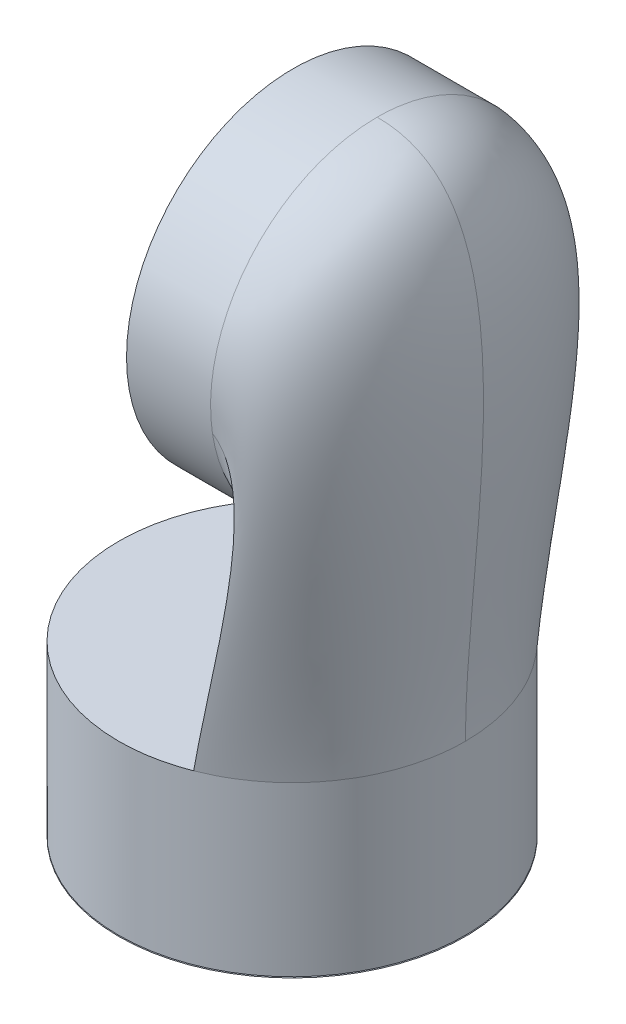
ISO-10303-21;
HEADER;
FILE_DESCRIPTION(('STEP AP214'),'2;1');
FILE_NAME('part.step','',(''),(''),'','','');
FILE_SCHEMA(('AUTOMOTIVE_DESIGN { 1 0 10303 214 1 1 1 1 }'));
ENDSEC;
DATA;
#1=APPLICATION_CONTEXT('core data for automotive mechanical design processes');
#2=APPLICATION_PROTOCOL_DEFINITION('international standard','automotive_design',2000,#1);
#3=PRODUCT_CONTEXT('',#1,'mechanical');
#4=PRODUCT('Part','Part','',(#3));
#5=PRODUCT_RELATED_PRODUCT_CATEGORY('part','',(#4));
#6=PRODUCT_DEFINITION_FORMATION('','',#4);
#7=PRODUCT_DEFINITION_CONTEXT('part definition',#1,'design');
#8=PRODUCT_DEFINITION('design','',#6,#7);
#9=PRODUCT_DEFINITION_SHAPE('','',#8);
#10=(LENGTH_UNIT() NAMED_UNIT(*) SI_UNIT(.MILLI.,.METRE.));
#11=(NAMED_UNIT(*) PLANE_ANGLE_UNIT() SI_UNIT($,.RADIAN.));
#12=(NAMED_UNIT(*) SI_UNIT($,.STERADIAN.) SOLID_ANGLE_UNIT());
#13=UNCERTAINTY_MEASURE_WITH_UNIT(LENGTH_MEASURE(1.E-05),#10,'distance_accuracy_value','');
#14=(GEOMETRIC_REPRESENTATION_CONTEXT(3) GLOBAL_UNCERTAINTY_ASSIGNED_CONTEXT((#13)) GLOBAL_UNIT_ASSIGNED_CONTEXT((#10,
#11,#12)) REPRESENTATION_CONTEXT('',''));
#15=CARTESIAN_POINT('',(0.,0.,0.));
#16=DIRECTION('',(0.,0.,1.));
#17=DIRECTION('',(1.,0.,0.));
#18=AXIS2_PLACEMENT_3D('',#15,#16,#17);
#19=CARTESIAN_POINT('',(0.25,118.750494926719,0.));
#20=DIRECTION('',(1.,0.,0.));
#21=DIRECTION('',(0.,0.,-1.));
#22=AXIS2_PLACEMENT_3D('',#19,#20,#21);
#23=PLANE('',#22);
#24=CARTESIAN_POINT('',(0.25,118.750494926719,0.));
#25=DIRECTION('',(1.,0.,0.));
#26=DIRECTION('',(0.,0.,-1.));
#27=AXIS2_PLACEMENT_3D('',#24,#25,#26);
#28=CIRCLE('',#27,39.6542142174496);
#29=CARTESIAN_POINT('',(0.25,118.750494926719,-39.6542142174496));
#30=VERTEX_POINT('',#29);
#31=EDGE_CURVE('E103',#30,#30,#28,.T.);
#32=ORIENTED_EDGE('',*,*,#31,.F.);
#33=EDGE_LOOP('',(#32));
#34=FACE_BOUND('',#33,.T.);
#35=ADVANCED_FACE('F45',(#34),#23,.F.);
#36=CARTESIAN_POINT('',(0.25,118.750494926719,0.));
#37=DIRECTION('',(1.,0.,0.));
#38=DIRECTION('',(0.,0.,-1.));
#39=AXIS2_PLACEMENT_3D('',#36,#37,#38);
#40=CYLINDRICAL_SURFACE('',#39,39.6542142174496);
#41=CARTESIAN_POINT('',(20.25,112.826886917139,-39.2092791740962));
#42=CARTESIAN_POINT('',(20.25,113.538679207074,-39.3168177632087));
#43=CARTESIAN_POINT('',(20.25,114.253402907254,-39.4049056334469));
#44=CARTESIAN_POINT('',(20.25,115.685413881789,-39.5419672587397));
#45=CARTESIAN_POINT('',(20.25,116.402695064723,-39.5910046455691));
#46=CARTESIAN_POINT('',(20.25,117.8377528083,-39.6500587961813));
#47=CARTESIAN_POINT('',(20.25,118.555526899412,-39.6601356150666));
#48=CARTESIAN_POINT('',(20.25,119.989508155326,-39.6413657401065));
#49=CARTESIAN_POINT('',(20.25,120.705716068375,-39.6125765323938));
#50=CARTESIAN_POINT('',(20.25,122.134504878901,-39.5161681335435));
#51=CARTESIAN_POINT('',(20.25,122.847089453413,-39.4486034323858));
#52=CARTESIAN_POINT('',(20.25,124.266643335228,-39.2751470612482));
#53=CARTESIAN_POINT('',(20.25,124.973618695871,-39.1693048991965));
#54=CARTESIAN_POINT('',(20.25,126.379984634424,-38.9197953732112));
#55=CARTESIAN_POINT('',(20.25,127.079383318844,-38.7761736995566));
#56=CARTESIAN_POINT('',(20.25,128.468626453505,-38.4516045506778));
#57=CARTESIAN_POINT('',(20.25,129.158480894523,-38.2706998508302));
#58=CARTESIAN_POINT('',(20.25,130.52666737922,-37.8720623386944));
#59=CARTESIAN_POINT('',(20.25,131.205010926831,-37.6543690091699));
#60=CARTESIAN_POINT('',(20.25,132.548350281502,-37.1830197254328));
#61=CARTESIAN_POINT('',(20.25,133.213358304493,-36.9293985783168));
#62=CARTESIAN_POINT('',(20.25,134.528216611923,-36.3870545916151));
#63=CARTESIAN_POINT('',(20.25,135.178079752472,-36.0983629199799));
#64=CARTESIAN_POINT('',(20.25,136.460837942644,-35.4867367457936));
#65=CARTESIAN_POINT('',(20.25,137.093746428444,-35.1638304276641));
#66=CARTESIAN_POINT('',(20.25,138.340783516624,-34.4846337925777));
#67=CARTESIAN_POINT('',(20.25,138.954925642034,-34.1283683044121));
#68=CARTESIAN_POINT('',(20.25,140.162827339532,-33.3836487385065));
#69=CARTESIAN_POINT('',(20.25,140.756599707525,-32.9952154117593));
#70=CARTESIAN_POINT('',(20.25,141.922170500539,-32.1873489104636));
#71=CARTESIAN_POINT('',(20.25,142.493981149709,-31.767933372493));
#72=CARTESIAN_POINT('',(20.25,143.614036370087,-30.8992894900928));
#73=CARTESIAN_POINT('',(20.25,144.162292576395,-30.4500761503661));
#74=CARTESIAN_POINT('',(20.25,145.233643946046,-29.5230257781004));
#75=CARTESIAN_POINT('',(20.25,145.756749556656,-29.0452008189779));
#76=CARTESIAN_POINT('',(20.25,146.776468866656,-28.0624014196157));
#77=CARTESIAN_POINT('',(20.25,147.273091174662,-27.5574359101313));
#78=CARTESIAN_POINT('',(20.25,148.238520492376,-26.5218221886072));
#79=CARTESIAN_POINT('',(20.25,148.707334581226,-25.9911805759359));
#80=CARTESIAN_POINT('',(20.25,149.615823142696,-24.9056801045418));
#81=CARTESIAN_POINT('',(20.25,150.055503091596,-24.3508258297278));
#82=CARTESIAN_POINT('',(20.25,150.904395676594,-23.2183702850421));
#83=CARTESIAN_POINT('',(20.25,151.313611456201,-22.6407713715547));
#84=CARTESIAN_POINT('',(20.25,152.100562999366,-21.4645279829414));
#85=CARTESIAN_POINT('',(20.25,152.478299228004,-20.8658838189243));
#86=CARTESIAN_POINT('',(20.25,153.201283094025,-19.6492441678615));
#87=CARTESIAN_POINT('',(20.25,153.546528950038,-19.0312476222441));
#88=CARTESIAN_POINT('',(20.25,154.203522418277,-17.7775965145554));
#89=CARTESIAN_POINT('',(20.25,154.515265838166,-17.1419397550648));
#90=CARTESIAN_POINT('',(20.25,155.104241814635,-15.8546695172395));
#91=CARTESIAN_POINT('',(20.25,155.381466968528,-15.2030526518809));
#92=CARTESIAN_POINT('',(20.25,155.90073999722,-13.8857296660037));
#93=CARTESIAN_POINT('',(20.25,156.142777423231,-13.2200194274953));
#94=CARTESIAN_POINT('',(20.25,156.591009551649,-11.876371771337));
#95=CARTESIAN_POINT('',(20.25,156.797191250805,-11.1984300158373));
#96=CARTESIAN_POINT('',(20.25,157.173045496436,-9.8321808074603));
#97=CARTESIAN_POINT('',(20.25,157.342702141993,-9.14386897900501));
#98=CARTESIAN_POINT('',(20.25,157.644838554529,-7.75875167017689));
#99=CARTESIAN_POINT('',(20.25,157.777298584916,-7.06194188459362));
#100=CARTESIAN_POINT('',(20.25,158.00475963956,-5.66180013711724));
#101=CARTESIAN_POINT('',(20.25,158.099737687527,-4.95846444437192));
#102=CARTESIAN_POINT('',(20.25,158.251950828867,-3.54723691532735));
#103=CARTESIAN_POINT('',(20.25,158.309160262992,-2.83934231081484));
#104=CARTESIAN_POINT('',(20.25,158.38555503717,-1.42096836448575));
#105=CARTESIAN_POINT('',(20.25,158.404711599579,-0.710487473245399));
#106=CARTESIAN_POINT('',(20.25,158.404709144169,0.));
#107=B_SPLINE_CURVE_WITH_KNOTS('',3,(#41,#42,#43,#44,#45,#46,#47,#48,#49,#50,#51,#52,#53,#54,
#55,#56,#57,#58,#59,#60,#61,#62,#63,#64,#65,#66,#67,#68,#69,#70,#71,#72,#73,#74,#75,#76,#77,#78,
#79,#80,#81,#82,#83,#84,#85,#86,#87,#88,#89,#90,#91,#92,#93,#94,#95,#96,#97,#98,#99,#100,#101,
#102,#103,#104,#105,#106),.UNSPECIFIED.,.F.,.F.,(4,2,2,2,2,2,2,2,2,2,2,2,2,2,2,2,2,2,2,2,2,2,2,
2,2,2,2,2,2,2,2,2,4),(0.,2.15933188098447,4.31513794408596,6.46761964879854,8.61692113704215,
10.7632096495528,12.9067320306947,15.0476738751432,17.1861729243601,19.3223912748724,
21.4565540203017,23.5888337762281,25.7193705179716,27.8483339463743,29.9759345532403,
32.1023332236863,34.2276691557863,36.352114482362,38.4758649774903,40.5990724881073,
42.7218797651446,44.8444676912883,46.9670242527284,49.0896971211472,51.2126353022722,
53.3360279812166,55.4600499068564,57.5848405201336,59.7105542834659,61.8373938323246,
63.965535106869,66.0951207147065,68.2263162184017),.UNSPECIFIED.);
#108=CARTESIAN_POINT('',(20.25,112.826886917139,-39.2092791740962));
#109=VERTEX_POINT('',#108);
#110=CARTESIAN_POINT('',(20.25,158.404709144169,0.));
#111=VERTEX_POINT('',#110);
#112=EDGE_CURVE('E87',#109,#111,#107,.T.);
#113=ORIENTED_EDGE('',*,*,#112,.F.);
#114=CARTESIAN_POINT('',(20.25,112.826886917139,39.2092791740963));
#115=CARTESIAN_POINT('',(20.25,110.54400930367,38.8643895867108));
#116=CARTESIAN_POINT('',(20.25,106.019864685507,37.7719285134895));
#117=CARTESIAN_POINT('',(20.25,99.5819491364114,34.9506579607566));
#118=CARTESIAN_POINT('',(20.25,93.7108228129393,31.0185236825138));
#119=CARTESIAN_POINT('',(20.25,88.6091803970717,26.090861691955));
#120=CARTESIAN_POINT('',(20.25,84.4541867592477,20.3234387091221));
#121=CARTESIAN_POINT('',(20.25,81.388791275882,13.9057928794481));
#122=CARTESIAN_POINT('',(20.25,79.5144346142563,7.05281948373348));
#123=CARTESIAN_POINT('',(20.25,79.0962807092697,2.34761794223845));
#124=CARTESIAN_POINT('',(20.25,79.0962807092697,-2.34761794223843));
#125=CARTESIAN_POINT('',(20.25,79.5144346142562,-7.05281948373349));
#126=CARTESIAN_POINT('',(20.25,81.3887912758821,-13.9057928794481));
#127=CARTESIAN_POINT('',(20.2499999999999,84.4541867592475,-20.3234387091221));
#128=CARTESIAN_POINT('',(20.2500000000001,88.6091803970717,-26.0908616919549));
#129=CARTESIAN_POINT('',(20.2499999999999,93.7108228129392,-31.0185236825137));
#130=CARTESIAN_POINT('',(20.25,99.5819491364113,-34.9506579607565));
#131=CARTESIAN_POINT('',(20.25,106.019864685507,-37.7719285134895));
#132=CARTESIAN_POINT('',(20.25,110.54400930367,-38.8643895867108));
#133=CARTESIAN_POINT('',(20.25,112.826886917139,-39.2092791740962));
#134=B_SPLINE_CURVE_WITH_KNOTS('',3,(#114,#115,#116,#117,#118,#119,#120,#121,#122,#123,#124,
#125,#126,#127,#128,#129,#130,#131,#132,#133),.UNSPECIFIED.,.F.,.F.,(4,1,1,1,1,1,1,1,2,1,1,1,1,
1,1,1,4),(0.277604933941406,0.30540431719873,0.333203700456055,0.361003083713379,
0.388802466970703,0.416601850228027,0.444401233485352,0.472200616742676,0.5,0.527799383257324,
0.555598766514648,0.583398149771973,0.611197533029297,0.638996916286621,0.666796299543945,
0.69459568280127,0.722395066058594),.UNSPECIFIED.);
#135=CARTESIAN_POINT('',(20.25,112.826886917139,39.2092791740963));
#136=VERTEX_POINT('',#135);
#137=EDGE_CURVE('E79',#136,#109,#134,.T.);
#138=ORIENTED_EDGE('',*,*,#137,.F.);
#139=CARTESIAN_POINT('',(20.25,158.404709144169,0.));
#140=CARTESIAN_POINT('',(20.25,158.40471159958,0.710487473245394));
#141=CARTESIAN_POINT('',(20.25,158.38555503717,1.42096836448575));
#142=CARTESIAN_POINT('',(20.25,158.309160262992,2.83934231081485));
#143=CARTESIAN_POINT('',(20.25,158.251950828867,3.54723691532735));
#144=CARTESIAN_POINT('',(20.25,158.099737687527,4.95846444437191));
#145=CARTESIAN_POINT('',(20.25,158.00475963956,5.66180013711723));
#146=CARTESIAN_POINT('',(20.25,157.777298584916,7.06194188459361));
#147=CARTESIAN_POINT('',(20.25,157.644838554528,7.75875167017688));
#148=CARTESIAN_POINT('',(20.25,157.342702141993,9.143868979005));
#149=CARTESIAN_POINT('',(20.25,157.173045496436,9.83218080746029));
#150=CARTESIAN_POINT('',(20.25,156.797191250805,11.1984300158373));
#151=CARTESIAN_POINT('',(20.25,156.591009551649,11.8763717713369));
#152=CARTESIAN_POINT('',(20.25,156.142777423231,13.2200194274953));
#153=CARTESIAN_POINT('',(20.25,155.90073999722,13.8857296660037));
#154=CARTESIAN_POINT('',(20.25,155.381466968528,15.2030526518808));
#155=CARTESIAN_POINT('',(20.25,155.104241814635,15.8546695172395));
#156=CARTESIAN_POINT('',(20.25,154.515265838166,17.1419397550647));
#157=CARTESIAN_POINT('',(20.25,154.203522418277,17.7775965145553));
#158=CARTESIAN_POINT('',(20.25,153.546528950038,19.031247622244));
#159=CARTESIAN_POINT('',(20.25,153.201283094025,19.6492441678615));
#160=CARTESIAN_POINT('',(20.25,152.478299228004,20.8658838189242));
#161=CARTESIAN_POINT('',(20.25,152.100562999366,21.4645279829414));
#162=CARTESIAN_POINT('',(20.25,151.313611456201,22.6407713715547));
#163=CARTESIAN_POINT('',(20.25,150.904395676594,23.2183702850421));
#164=CARTESIAN_POINT('',(20.25,150.055503091596,24.3508258297279));
#165=CARTESIAN_POINT('',(20.25,149.615823142695,24.9056801045418));
#166=CARTESIAN_POINT('',(20.25,148.707334581226,25.9911805759359));
#167=CARTESIAN_POINT('',(20.25,148.238520492376,26.5218221886072));
#168=CARTESIAN_POINT('',(20.25,147.273091174662,27.5574359101313));
#169=CARTESIAN_POINT('',(20.25,146.776468866656,28.0624014196157));
#170=CARTESIAN_POINT('',(20.25,145.756749556656,29.0452008189779));
#171=CARTESIAN_POINT('',(20.25,145.233643946046,29.5230257781004));
#172=CARTESIAN_POINT('',(20.25,144.162292576396,30.4500761503661));
#173=CARTESIAN_POINT('',(20.25,143.614036370087,30.8992894900928));
#174=CARTESIAN_POINT('',(20.25,142.493981149709,31.767933372493));
#175=CARTESIAN_POINT('',(20.25,141.922170500539,32.1873489104635));
#176=CARTESIAN_POINT('',(20.25,140.756599707525,32.9952154117593));
#177=CARTESIAN_POINT('',(20.25,140.162827339532,33.3836487385064));
#178=CARTESIAN_POINT('',(20.25,138.954925642034,34.128368304412));
#179=CARTESIAN_POINT('',(20.25,138.340783516624,34.4846337925777));
#180=CARTESIAN_POINT('',(20.25,137.093746428444,35.163830427664));
#181=CARTESIAN_POINT('',(20.25,136.460837942644,35.4867367457936));
#182=CARTESIAN_POINT('',(20.25,135.178079752472,36.0983629199798));
#183=CARTESIAN_POINT('',(20.25,134.528216611923,36.3870545916151));
#184=CARTESIAN_POINT('',(20.25,133.213358304493,36.9293985783168));
#185=CARTESIAN_POINT('',(20.25,132.548350281502,37.1830197254328));
#186=CARTESIAN_POINT('',(20.25,131.205010926831,37.65436900917));
#187=CARTESIAN_POINT('',(20.25,130.52666737922,37.8720623386945));
#188=CARTESIAN_POINT('',(20.25,129.158480894523,38.2706998508302));
#189=CARTESIAN_POINT('',(20.25,128.468626453505,38.4516045506779));
#190=CARTESIAN_POINT('',(20.25,127.079383318844,38.7761736995566));
#191=CARTESIAN_POINT('',(20.25,126.379984634424,38.9197953732112));
#192=CARTESIAN_POINT('',(20.25,124.973618695871,39.1693048991965));
#193=CARTESIAN_POINT('',(20.25,124.266643335228,39.2751470612482));
#194=CARTESIAN_POINT('',(20.25,122.847089453413,39.4486034323858));
#195=CARTESIAN_POINT('',(20.25,122.134504878901,39.5161681335434));
#196=CARTESIAN_POINT('',(20.25,120.705716068375,39.6125765323938));
#197=CARTESIAN_POINT('',(20.25,119.989508155326,39.6413657401065));
#198=CARTESIAN_POINT('',(20.25,118.555526899412,39.6601356150666));
#199=CARTESIAN_POINT('',(20.25,117.8377528083,39.6500587961813));
#200=CARTESIAN_POINT('',(20.25,116.402695064724,39.5910046455691));
#201=CARTESIAN_POINT('',(20.25,115.685413881789,39.5419672587397));
#202=CARTESIAN_POINT('',(20.25,114.253402907254,39.404905633447));
#203=CARTESIAN_POINT('',(20.25,113.538679207074,39.3168177632088));
#204=CARTESIAN_POINT('',(20.25,112.826886917139,39.2092791740963));
#205=B_SPLINE_CURVE_WITH_KNOTS('',3,(#139,#140,#141,#142,#143,#144,#145,#146,#147,#148,#149,
#150,#151,#152,#153,#154,#155,#156,#157,#158,#159,#160,#161,#162,#163,#164,#165,#166,#167,#168,
#169,#170,#171,#172,#173,#174,#175,#176,#177,#178,#179,#180,#181,#182,#183,#184,#185,#186,#187,
#188,#189,#190,#191,#192,#193,#194,#195,#196,#197,#198,#199,#200,#201,#202,#203,#204),
.UNSPECIFIED.,.F.,.F.,(4,2,2,2,2,2,2,2,2,2,2,2,2,2,2,2,2,2,2,2,2,2,2,2,2,2,2,2,2,2,2,2,4),(0.,
2.13119550369523,4.26078111153268,6.38892238607711,8.5157619349358,10.6414756982681,
12.7662663115452,14.890288237185,17.0136809161293,19.1366190972543,21.2592919656732,
23.3818485271135,25.5044364532572,27.6272437302945,29.7504512409115,31.8742017360396,
33.9986470626152,36.1239829947152,38.2503816651612,40.3779822720273,42.5069457004301,
44.6374824421736,46.7697621981001,48.9039249435293,51.0401432940417,53.1786423432585,
55.319584187707,57.4631065688488,59.6093950813595,61.7586965696031,63.9111782743157,
66.0669843374172,68.2263162184017),.UNSPECIFIED.);
#206=EDGE_CURVE('E84',#111,#136,#205,.T.);
#207=ORIENTED_EDGE('',*,*,#206,.F.);
#208=EDGE_LOOP('',(#113,#138,#207));
#209=FACE_BOUND('',#208,.T.);
#210=ORIENTED_EDGE('',*,*,#31,.T.);
#211=EDGE_LOOP('',(#210));
#212=FACE_BOUND('',#211,.T.);
#213=ADVANCED_FACE('F82',(#209,#212),#40,.T.);
#214=CARTESIAN_POINT('',(0.,0.25,0.));
#215=DIRECTION('',(0.,1.,0.));
#216=DIRECTION('',(0.,0.,1.));
#217=AXIS2_PLACEMENT_3D('',#214,#215,#216);
#218=PLANE('',#217);
#219=CARTESIAN_POINT('',(0.,0.25,0.));
#220=DIRECTION('',(0.,1.,0.));
#221=DIRECTION('',(0.,0.,1.));
#222=AXIS2_PLACEMENT_3D('',#219,#220,#221);
#223=CIRCLE('',#222,41.25);
#224=CARTESIAN_POINT('',(0.,0.25,41.25));
#225=VERTEX_POINT('',#224);
#226=EDGE_CURVE('E215',#225,#225,#223,.T.);
#227=ORIENTED_EDGE('',*,*,#226,.F.);
#228=EDGE_LOOP('',(#227));
#229=FACE_BOUND('',#228,.T.);
#230=ADVANCED_FACE('F278',(#229),#218,.F.);
#231=CARTESIAN_POINT('',(20.25,158.404709144169,0.));
#232=CARTESIAN_POINT('',(59.6828063975361,158.404709144169,0.));
#233=CARTESIAN_POINT('',(41.25,82.155918341488,0.));
#234=CARTESIAN_POINT('',(41.25,40.25,0.));
#235=CARTESIAN_POINT('',(20.25,158.404709144169,2.84310651852282));
#236=CARTESIAN_POINT('',(59.6828063975361,158.404709144169,2.58211817940237));
#237=CARTESIAN_POINT('',(41.25,82.155918341488,2.32112984028193));
#238=CARTESIAN_POINT('',(41.25,40.25,2.06014150116148));
#239=CARTESIAN_POINT('',(20.25,157.791277918713,8.51949822739429));
#240=CARTESIAN_POINT('',(59.2666167840883,157.616357764454,7.74216484732837));
#241=CARTESIAN_POINT('',(40.9750438330487,81.9271561686564,6.96483146726243));
#242=CARTESIAN_POINT('',(40.9387129049681,40.25,6.1874980871965));
#243=CARTESIAN_POINT('',(20.25,155.085845702585,16.626058427123));
#244=CARTESIAN_POINT('',(57.5290899264147,154.263432568896,15.1681671520485));
#245=CARTESIAN_POINT('',(39.77627879985,80.9261749847936,13.710275876974));
#246=CARTESIAN_POINT('',(39.5536091303601,40.25,12.2523846018995));
#247=CARTESIAN_POINT('',(20.25,150.723673109632,23.9665092224747));
#248=CARTESIAN_POINT('',(54.8136470340799,148.983789728978,21.9922573605722));
#249=CARTESIAN_POINT('',(37.829720701962,79.3203167044279,20.0180054986696));
#250=CARTESIAN_POINT('',(37.2660203767278,40.25,18.0437536367671));
#251=CARTESIAN_POINT('',(20.25,144.899289745089,30.2153174922977));
#252=CARTESIAN_POINT('',(51.2725746080998,142.065099462403,27.9527672342682));
#253=CARTESIAN_POINT('',(35.2078274538161,77.1845370237099,25.6902169762387));
#254=CARTESIAN_POINT('',(34.1425150916308,40.25,23.4276667182091));
#255=CARTESIAN_POINT('',(20.25,137.867651030673,35.090943761725));
#256=CARTESIAN_POINT('',(47.05815914949,133.835315864529,32.8173576320284));
#257=CARTESIAN_POINT('',(31.983056969844,74.613933577618,30.5437715023317));
#258=CARTESIAN_POINT('',(30.2496617226288,40.25,28.2701853726351));
#259=CARTESIAN_POINT('',(20.25,129.935077805674,38.365547505668));
#260=CARTESIAN_POINT('',(42.336123281619,124.656636642427,36.3999881029346));
#261=CARTESIAN_POINT('',(28.2547394091828,71.7207258069874,34.4344287002011));
#262=CARTESIAN_POINT('',(25.6943370843398,40.25,32.4688692974676));
#263=CARTESIAN_POINT('',(20.25,121.449672481848,39.874514726519));
#264=CARTESIAN_POINT('',(37.2721896278554,114.919113884815,38.5567692143891));
#265=CARTESIAN_POINT('',(24.1222049309699,68.6310603434764,37.2390237022591));
#266=CARTESIAN_POINT('',(20.5834179913822,40.25,35.9212781901292));
#267=CARTESIAN_POINT('',(20.25,115.676491903936,39.6397880556542));
#268=CARTESIAN_POINT('',(33.7843157857522,108.328399590334,38.9888199295478));
#269=CARTESIAN_POINT('',(21.1749881773954,66.5311569145493,38.3378518034413));
#270=CARTESIAN_POINT('',(16.8935896089758,40.25,37.6868836773349));
#271=CARTESIAN_POINT('',(20.25,112.826886917139,39.2092791740963));
#272=CARTESIAN_POINT('',(32.0414027925522,105.078645782111,38.948207906847));
#273=CARTESIAN_POINT('',(19.6726524028172,65.494874411173,38.6871366395977));
#274=CARTESIAN_POINT('',(15.,40.25,38.4260653723485));
#275=B_SPLINE_SURFACE_WITH_KNOTS('',3,3,((#231,#232,#233,#234),(#235,#236,#237,#238),(#239,#240,
#241,#242),(#243,#244,#245,#246),(#247,#248,#249,#250),(#251,#252,#253,#254),(#255,#256,#257,
#258),(#259,#260,#261,#262),(#263,#264,#265,#266),(#267,#268,#269,#270),(#271,#272,#273,#274)),
.UNSPECIFIED.,.F.,.F.,.F.,(4,1,1,1,1,1,1,1,4),(4,4),(0.,0.0347006167426758,0.0694012334853515,
0.104101850228027,0.138802466970703,0.173503083713379,0.208203700456055,0.24290431719873,
0.277604933941406),(0.,1.),.UNSPECIFIED.);
#276=CARTESIAN_POINT('',(15.,40.25,38.4260653723485));
#277=CARTESIAN_POINT('',(16.8935896089758,40.25,37.6868836773349));
#278=CARTESIAN_POINT('',(20.5834179913822,40.25,35.9212781901292));
#279=CARTESIAN_POINT('',(25.6943370843398,40.25,32.4688692974676));
#280=CARTESIAN_POINT('',(30.2496617226288,40.25,28.2701853726351));
#281=CARTESIAN_POINT('',(34.1425150916308,40.25,23.4276667182091));
#282=CARTESIAN_POINT('',(37.2660203767278,40.25,18.0437536367671));
#283=CARTESIAN_POINT('',(39.5536091303601,40.25,12.2523846018995));
#284=CARTESIAN_POINT('',(40.9387129049681,40.25,6.1874980871965));
#285=CARTESIAN_POINT('',(41.25,40.25,2.06014150116148));
#286=CARTESIAN_POINT('',(41.25,40.25,0.));
#287=B_SPLINE_CURVE_WITH_KNOTS('',3,(#276,#277,#278,#279,#280,#281,#282,#283,#284,#285,#286),
.UNSPECIFIED.,.F.,.F.,(4,1,1,1,1,1,1,1,4),(0.,0.0347006167426758,0.0694012334853515,
0.104101850228027,0.138802466970703,0.173503083713379,0.208203700456055,0.24290431719873,
0.277604933941406),.UNSPECIFIED.);
#288=CARTESIAN_POINT('',(41.25,40.25,0.));
#289=VERTEX_POINT('',#288);
#290=CARTESIAN_POINT('',(15.,40.25,38.4260653723485));
#291=VERTEX_POINT('',#290);
#292=EDGE_CURVE('E185',#289,#291,#287,.F.);
#293=CARTESIAN_POINT('',(20.25,158.404709144169,0.));
#294=CARTESIAN_POINT('',(59.6828063975361,158.404709144169,0.));
#295=CARTESIAN_POINT('',(41.25,82.155918341488,0.));
#296=CARTESIAN_POINT('',(41.25,40.25,0.));
#297=B_SPLINE_CURVE_WITH_KNOTS('',3,(#293,#294,#295,#296),.UNSPECIFIED.,.F.,.F.,(4,4),(0.,1.),.UNSPECIFIED.);
#298=EDGE_CURVE('E101',#111,#289,#297,.T.);
#299=CARTESIAN_POINT('',(20.25,112.826886917139,39.2092791740963));
#300=CARTESIAN_POINT('',(32.0414027925522,105.078645782111,38.948207906847));
#301=CARTESIAN_POINT('',(19.6726524028172,65.494874411173,38.6871366395977));
#302=CARTESIAN_POINT('',(15.,40.25,38.4260653723485));
#303=B_SPLINE_CURVE_WITH_KNOTS('',3,(#299,#300,#301,#302),.UNSPECIFIED.,.F.,.F.,(4,4),(0.,1.),.UNSPECIFIED.);
#304=EDGE_CURVE('E93',#291,#136,#303,.F.);
#305=ORIENTED_EDGE('',*,*,#292,.F.);
#306=ORIENTED_EDGE('',*,*,#298,.F.);
#307=ORIENTED_EDGE('',*,*,#206,.T.);
#308=ORIENTED_EDGE('',*,*,#304,.F.);
#309=EDGE_LOOP('',(#305,#306,#307,#308));
#310=FACE_BOUND('',#309,.T.);
#311=ADVANCED_FACE('F99',(#310),#275,.T.);
#312=CARTESIAN_POINT('',(20.25,112.826886917139,39.2092791740963));
#313=CARTESIAN_POINT('',(32.0414027925522,105.078645782111,38.948207906847));
#314=CARTESIAN_POINT('',(19.6726524028172,65.494874411173,38.6871366395977));
#315=CARTESIAN_POINT('',(15.,40.25,38.4260653723485));
#316=CARTESIAN_POINT('',(20.25,110.54400930367,38.8643895867108));
#317=CARTESIAN_POINT('',(31.1507836981623,102.47520065431,38.1754555494929));
#318=CARTESIAN_POINT('',(19.4804293313903,64.6646870205667,37.4865215122749));
#319=CARTESIAN_POINT('',(15.,40.25,36.7975874750569));
#320=CARTESIAN_POINT('',(20.25,106.019864685507,37.7719285134895));
#321=CARTESIAN_POINT('',(29.3916862193101,97.3229374607186,36.3661963893735));
#322=CARTESIAN_POINT('',(19.1007618366619,63.019903448708,34.9604642652575));
#323=CARTESIAN_POINT('',(15.,40.25,33.5547321411415));
#324=CARTESIAN_POINT('',(20.25,99.5819491364114,34.9506579607566));
#325=CARTESIAN_POINT('',(26.8863521384683,89.9886316953476,32.8751682490353));
#326=CARTESIAN_POINT('',(18.5600334657977,60.679190957218,30.7996785373139));
#327=CARTESIAN_POINT('',(15.,40.25,28.7241888255926));
#328=CARTESIAN_POINT('',(20.25,93.7108228129393,31.0185236825138));
#329=CARTESIAN_POINT('',(24.5812202027162,83.2753016577446,28.6519569545721));
#330=CARTESIAN_POINT('',(18.0625148930142,58.5429700021434,26.2853902266305));
#331=CARTESIAN_POINT('',(15.,40.25,23.9188234986889));
#332=CARTESIAN_POINT('',(20.25,88.6091803970717,26.090861691955));
#333=CARTESIAN_POINT('',(22.543180419707,77.3993052736665,23.7708903644121));
#334=CARTESIAN_POINT('',(17.6226430451637,56.6840048651045,21.4509190368693));
#335=CARTESIAN_POINT('',(15.,40.25,19.1309477093265));
#336=CARTESIAN_POINT('',(20.25,84.4541867592477,20.3234387091221));
#337=CARTESIAN_POINT('',(20.839122797094,72.5599805945087,18.3332501415484));
#338=CARTESIAN_POINT('',(17.2548548490981,55.1665498905406,16.3430615739748));
#339=CARTESIAN_POINT('',(15.,40.25,14.3528730064011));
#340=CARTESIAN_POINT('',(20.25,81.388791275882,13.9057928794481));
#341=CARTESIAN_POINT('',(19.5359373425305,68.9338553423174,12.462930627735));
#342=CARTESIAN_POINT('',(16.97358723167,54.0434542582163,11.0200683760219));
#343=CARTESIAN_POINT('',(15.,40.25,9.57720612430878));
#344=CARTESIAN_POINT('',(20.25,79.5144346142563,7.05281948373348));
#345=CARTESIAN_POINT('',(18.7005140636698,66.6697847663828,6.30073092163744));
#346=CARTESIAN_POINT('',(16.7932771197313,53.3537309115185,5.5486423595414));
#347=CARTESIAN_POINT('',(15.,40.25,4.79655379744536));
#348=CARTESIAN_POINT('',(20.25,79.0962807092697,2.34761794223845));
#349=CARTESIAN_POINT('',(18.5,66.1475204728465,2.09877398055269));
#350=CARTESIAN_POINT('',(16.75,53.1987602364232,1.84993001886694));
#351=CARTESIAN_POINT('',(15.,40.25,1.60108605718119));
#352=CARTESIAN_POINT('',(20.25,79.0962807092697,-2.34761794223843));
#353=CARTESIAN_POINT('',(18.5,66.1475204728465,-2.09877398055269));
#354=CARTESIAN_POINT('',(16.75,53.1987602364232,-1.84993001886694));
#355=CARTESIAN_POINT('',(15.,40.25,-1.60108605718119));
#356=CARTESIAN_POINT('',(20.25,79.5144346142562,-7.05281948373349));
#357=CARTESIAN_POINT('',(18.7005140636698,66.6697847663827,-6.30073092163745));
#358=CARTESIAN_POINT('',(16.7932771197313,53.3537309115185,-5.5486423595414));
#359=CARTESIAN_POINT('',(15.,40.25,-4.79655379744535));
#360=CARTESIAN_POINT('',(20.25,81.3887912758821,-13.9057928794481));
#361=CARTESIAN_POINT('',(19.5359373425305,68.9338553423174,-12.462930627735));
#362=CARTESIAN_POINT('',(16.97358723167,54.0434542582163,-11.0200683760219));
#363=CARTESIAN_POINT('',(15.,40.25,-9.57720612430876));
#364=CARTESIAN_POINT('',(20.2499999999999,84.4541867592475,-20.3234387091221));
#365=CARTESIAN_POINT('',(20.8391227970939,72.5599805945086,-18.3332501415484));
#366=CARTESIAN_POINT('',(17.2548548490981,55.1665498905405,-16.3430615739748));
#367=CARTESIAN_POINT('',(15.,40.25,-14.3528730064011));
#368=CARTESIAN_POINT('',(20.2500000000001,88.6091803970717,-26.0908616919549));
#369=CARTESIAN_POINT('',(22.543180419707,77.3993052736665,-23.7708903644121));
#370=CARTESIAN_POINT('',(17.6226430451637,56.6840048651045,-21.4509190368693));
#371=CARTESIAN_POINT('',(15.,40.25,-19.1309477093265));
#372=CARTESIAN_POINT('',(20.2499999999999,93.7108228129392,-31.0185236825137));
#373=CARTESIAN_POINT('',(24.5812202027161,83.2753016577445,-28.6519569545721));
#374=CARTESIAN_POINT('',(18.0625148930142,58.5429700021434,-26.2853902266305));
#375=CARTESIAN_POINT('',(15.,40.25,-23.9188234986889));
#376=CARTESIAN_POINT('',(20.25,99.5819491364113,-34.9506579607565));
#377=CARTESIAN_POINT('',(26.8863521384683,89.9886316953476,-32.8751682490352));
#378=CARTESIAN_POINT('',(18.5600334657977,60.679190957218,-30.7996785373139));
#379=CARTESIAN_POINT('',(15.,40.25,-28.7241888255926));
#380=CARTESIAN_POINT('',(20.25,106.019864685507,-37.7719285134895));
#381=CARTESIAN_POINT('',(29.3916862193101,97.3229374607186,-36.3661963893735));
#382=CARTESIAN_POINT('',(19.1007618366619,63.019903448708,-34.9604642652575));
#383=CARTESIAN_POINT('',(15.,40.25,-33.5547321411415));
#384=CARTESIAN_POINT('',(20.25,110.54400930367,-38.8643895867108));
#385=CARTESIAN_POINT('',(31.1507836981623,102.47520065431,-38.1754555494929));
#386=CARTESIAN_POINT('',(19.4804293313903,64.6646870205667,-37.4865215122749));
#387=CARTESIAN_POINT('',(15.,40.25,-36.7975874750569));
#388=CARTESIAN_POINT('',(20.25,112.826886917139,-39.2092791740962));
#389=CARTESIAN_POINT('',(32.0414027925522,105.078645782111,-38.948207906847));
#390=CARTESIAN_POINT('',(19.6726524028172,65.494874411173,-38.6871366395977));
#391=CARTESIAN_POINT('',(15.,40.25,-38.4260653723485));
#392=B_SPLINE_SURFACE_WITH_KNOTS('',3,3,((#312,#313,#314,#315),(#316,#317,#318,#319),(#320,#321,
#322,#323),(#324,#325,#326,#327),(#328,#329,#330,#331),(#332,#333,#334,#335),(#336,#337,#338,
#339),(#340,#341,#342,#343),(#344,#345,#346,#347),(#348,#349,#350,#351),(#352,#353,#354,#355),
(#356,#357,#358,#359),(#360,#361,#362,#363),(#364,#365,#366,#367),(#368,#369,#370,#371),(#372,
#373,#374,#375),(#376,#377,#378,#379),(#380,#381,#382,#383),(#384,#385,#386,#387),(#388,#389,
#390,#391)),.UNSPECIFIED.,.F.,.F.,.F.,(4,1,1,1,1,1,1,1,2,1,1,1,1,1,1,1,4),(4,4),
(0.277604933941406,0.30540431719873,0.333203700456055,0.361003083713379,0.388802466970703,
0.416601850228027,0.444401233485352,0.472200616742676,0.5,0.527799383257324,0.555598766514648,
0.583398149771973,0.611197533029297,0.638996916286621,0.666796299543945,0.69459568280127,
0.722395066058594),(0.,1.),.UNSPECIFIED.);
#393=DIRECTION('',(0.,0.,1.));
#394=VECTOR('',#393,1.);
#395=CARTESIAN_POINT('',(15.,40.25,0.));
#396=LINE('',#395,#394);
#397=CARTESIAN_POINT('',(15.,40.25,-38.4260653723485));
#398=VERTEX_POINT('',#397);
#399=EDGE_CURVE('E107',#291,#398,#396,.F.);
#400=CARTESIAN_POINT('',(20.25,112.826886917139,-39.2092791740962));
#401=CARTESIAN_POINT('',(32.0414027925522,105.078645782111,-38.948207906847));
#402=CARTESIAN_POINT('',(19.6726524028172,65.494874411173,-38.6871366395977));
#403=CARTESIAN_POINT('',(15.,40.25,-38.4260653723485));
#404=B_SPLINE_CURVE_WITH_KNOTS('',3,(#400,#401,#402,#403),.UNSPECIFIED.,.F.,.F.,(4,4),(0.,1.),.UNSPECIFIED.);
#405=EDGE_CURVE('E166',#398,#109,#404,.F.);
#406=ORIENTED_EDGE('',*,*,#399,.F.);
#407=ORIENTED_EDGE('',*,*,#304,.T.);
#408=ORIENTED_EDGE('',*,*,#137,.T.);
#409=ORIENTED_EDGE('',*,*,#405,.F.);
#410=EDGE_LOOP('',(#406,#407,#408,#409));
#411=FACE_BOUND('',#410,.T.);
#412=ADVANCED_FACE('F105',(#411),#392,.T.);
#413=CARTESIAN_POINT('',(20.25,112.826886917139,-39.2092791740962));
#414=CARTESIAN_POINT('',(32.0414027925522,105.078645782111,-38.948207906847));
#415=CARTESIAN_POINT('',(19.6726524028172,65.494874411173,-38.6871366395977));
#416=CARTESIAN_POINT('',(15.,40.25,-38.4260653723485));
#417=CARTESIAN_POINT('',(20.25,115.676491903936,-39.6397880556542));
#418=CARTESIAN_POINT('',(33.7843157857522,108.328399590334,-38.9888199295477));
#419=CARTESIAN_POINT('',(21.1749881773954,66.5311569145493,-38.3378518034413));
#420=CARTESIAN_POINT('',(16.8935896089757,40.25,-37.6868836773349));
#421=CARTESIAN_POINT('',(20.2500000000001,121.449672481848,-39.8745147265191));
#422=CARTESIAN_POINT('',(37.2721896278554,114.919113884814,-38.5567692143891));
#423=CARTESIAN_POINT('',(24.1222049309699,68.6310603434764,-37.2390237022592));
#424=CARTESIAN_POINT('',(20.5834179913821,40.25,-35.9212781901292));
#425=CARTESIAN_POINT('',(20.2499999999999,129.935077805674,-38.3655475056679));
#426=CARTESIAN_POINT('',(42.3361232816189,124.656636642427,-36.3999881029345));
#427=CARTESIAN_POINT('',(28.2547394091827,71.7207258069875,-34.434428700201));
#428=CARTESIAN_POINT('',(25.6943370843398,40.25,-32.4688692974676));
#429=CARTESIAN_POINT('',(20.2500000000001,137.867651030673,-35.0909437617251));
#430=CARTESIAN_POINT('',(47.05815914949,133.835315864529,-32.8173576320284));
#431=CARTESIAN_POINT('',(31.983056969844,74.613933577618,-30.5437715023318));
#432=CARTESIAN_POINT('',(30.2496617226288,40.25,-28.2701853726351));
#433=CARTESIAN_POINT('',(20.2499999999999,144.899289745088,-30.2153174922977));
#434=CARTESIAN_POINT('',(51.2725746080998,142.065099462403,-27.9527672342682));
#435=CARTESIAN_POINT('',(35.2078274538161,77.1845370237096,-25.6902169762387));
#436=CARTESIAN_POINT('',(34.1425150916309,40.2499999999999,-23.4276667182092));
#437=CARTESIAN_POINT('',(20.2500000000001,150.723673109633,-23.9665092224746));
#438=CARTESIAN_POINT('',(54.81364703408,148.983789728979,-21.9922573605721));
#439=CARTESIAN_POINT('',(37.829720701962,79.3203167044281,-20.0180054986696));
#440=CARTESIAN_POINT('',(37.2660203767278,40.25,-18.0437536367672));
#441=CARTESIAN_POINT('',(20.25,155.085845702585,-16.6260584271231));
#442=CARTESIAN_POINT('',(57.5290899264146,154.263432568895,-15.1681671520485));
#443=CARTESIAN_POINT('',(39.77627879985,80.9261749847934,-13.710275876974));
#444=CARTESIAN_POINT('',(39.55360913036,40.2500000000001,-12.2523846018994));
#445=CARTESIAN_POINT('',(20.25,157.791277918714,-8.51949822739425));
#446=CARTESIAN_POINT('',(59.2666167840883,157.616357764454,-7.74216484732833));
#447=CARTESIAN_POINT('',(40.9750438330487,81.9271561686566,-6.96483146726241));
#448=CARTESIAN_POINT('',(40.938712904968,40.25,-6.18749808719649));
#449=CARTESIAN_POINT('',(20.25,158.404709144169,-2.84310651852283));
#450=CARTESIAN_POINT('',(59.6828063975361,158.404709144169,-2.58211817940237));
#451=CARTESIAN_POINT('',(41.25,82.155918341488,-2.32112984028193));
#452=CARTESIAN_POINT('',(41.25,40.25,-2.06014150116148));
#453=CARTESIAN_POINT('',(20.25,158.404709144169,0.));
#454=CARTESIAN_POINT('',(59.6828063975361,158.404709144169,0.));
#455=CARTESIAN_POINT('',(41.25,82.155918341488,0.));
#456=CARTESIAN_POINT('',(41.25,40.25,0.));
#457=B_SPLINE_SURFACE_WITH_KNOTS('',3,3,((#413,#414,#415,#416),(#417,#418,#419,#420),(#421,#422,
#423,#424),(#425,#426,#427,#428),(#429,#430,#431,#432),(#433,#434,#435,#436),(#437,#438,#439,
#440),(#441,#442,#443,#444),(#445,#446,#447,#448),(#449,#450,#451,#452),(#453,#454,#455,#456)),
.UNSPECIFIED.,.F.,.F.,.F.,(4,1,1,1,1,1,1,1,4),(4,4),(0.722395066058594,0.75709568280127,
0.791796299543945,0.826496916286621,0.861197533029297,0.895898149771973,0.930598766514648,
0.965299383257324,1.),(0.,1.),.UNSPECIFIED.);
#458=CARTESIAN_POINT('',(41.25,40.25,0.));
#459=CARTESIAN_POINT('',(41.25,40.25,-2.06014150116148));
#460=CARTESIAN_POINT('',(40.938712904968,40.25,-6.18749808719649));
#461=CARTESIAN_POINT('',(39.55360913036,40.2500000000001,-12.2523846018994));
#462=CARTESIAN_POINT('',(37.2660203767278,40.25,-18.0437536367672));
#463=CARTESIAN_POINT('',(34.1425150916309,40.2499999999999,-23.4276667182092));
#464=CARTESIAN_POINT('',(30.2496617226288,40.25,-28.2701853726351));
#465=CARTESIAN_POINT('',(25.6943370843398,40.25,-32.4688692974676));
#466=CARTESIAN_POINT('',(20.5834179913821,40.25,-35.9212781901292));
#467=CARTESIAN_POINT('',(16.8935896089757,40.25,-37.6868836773349));
#468=CARTESIAN_POINT('',(15.,40.25,-38.4260653723485));
#469=B_SPLINE_CURVE_WITH_KNOTS('',3,(#458,#459,#460,#461,#462,#463,#464,#465,#466,#467,#468),
.UNSPECIFIED.,.F.,.F.,(4,1,1,1,1,1,1,1,4),(0.722395066058594,0.75709568280127,0.791796299543945,
0.826496916286621,0.861197533029297,0.895898149771973,0.930598766514648,0.965299383257324,1.),.UNSPECIFIED.);
#470=EDGE_CURVE('E56',#398,#289,#469,.F.);
#471=ORIENTED_EDGE('',*,*,#470,.F.);
#472=ORIENTED_EDGE('',*,*,#405,.T.);
#473=ORIENTED_EDGE('',*,*,#112,.T.);
#474=ORIENTED_EDGE('',*,*,#298,.T.);
#475=EDGE_LOOP('',(#471,#472,#473,#474));
#476=FACE_BOUND('',#475,.T.);
#477=ADVANCED_FACE('F131',(#476),#457,.T.);
#478=CARTESIAN_POINT('',(0.,40.25,0.));
#479=DIRECTION('',(0.,1.,0.));
#480=DIRECTION('',(0.,0.,1.));
#481=AXIS2_PLACEMENT_3D('',#478,#479,#480);
#482=PLANE('',#481);
#483=CARTESIAN_POINT('',(0.,40.25,0.));
#484=DIRECTION('',(0.,-1.,0.));
#485=DIRECTION('',(0.363636363636363,0.,0.9315409787236));
#486=AXIS2_PLACEMENT_3D('',#483,#484,#485);
#487=CIRCLE('',#486,41.25);
#488=EDGE_CURVE('E12',#291,#398,#487,.T.);
#489=ORIENTED_EDGE('',*,*,#488,.F.);
#490=ORIENTED_EDGE('',*,*,#399,.T.);
#491=EDGE_LOOP('',(#489,#490));
#492=FACE_BOUND('',#491,.T.);
#493=ADVANCED_FACE('F143',(#492),#482,.T.);
#494=CARTESIAN_POINT('',(0.,0.25,0.));
#495=DIRECTION('',(0.,1.,0.));
#496=DIRECTION('',(0.,0.,1.));
#497=AXIS2_PLACEMENT_3D('',#494,#495,#496);
#498=CYLINDRICAL_SURFACE('',#497,41.25);
#499=ORIENTED_EDGE('',*,*,#488,.T.);
#500=ORIENTED_EDGE('',*,*,#470,.T.);
#501=ORIENTED_EDGE('',*,*,#292,.T.);
#502=EDGE_LOOP('',(#499,#500,#501));
#503=FACE_BOUND('',#502,.T.);
#504=ORIENTED_EDGE('',*,*,#226,.T.);
#505=EDGE_LOOP('',(#504));
#506=FACE_BOUND('',#505,.T.);
#507=ADVANCED_FACE('F188',(#503,#506),#498,.T.);
#508=CLOSED_SHELL('',(#35,#213,#230,#311,#412,#477,#493,#507));
#509=MANIFOLD_SOLID_BREP('B2',#508);
#510=CARTESIAN_POINT('',(0.,0.,0.));
#511=DIRECTION('',(0.,1.,0.));
#512=DIRECTION('',(0.,0.,1.));
#513=AXIS2_PLACEMENT_3D('',#510,#511,#512);
#514=PLANE('',#513);
#515=CARTESIAN_POINT('',(0.,0.,0.));
#516=DIRECTION('',(0.,1.,0.));
#517=DIRECTION('',(0.,0.,1.));
#518=AXIS2_PLACEMENT_3D('',#515,#516,#517);
#519=CIRCLE('',#518,41.25);
#520=CARTESIAN_POINT('',(0.,0.,41.25));
#521=VERTEX_POINT('',#520);
#522=EDGE_CURVE('E44',#521,#521,#519,.T.);
#523=ORIENTED_EDGE('',*,*,#522,.T.);
#524=EDGE_LOOP('',(#523));
#525=FACE_BOUND('',#524,.T.);
#526=ADVANCED_FACE('F404',(#525),#514,.T.);
#527=OPEN_SHELL('',(#526));
#528=SHELL_BASED_SURFACE_MODEL('B6',(#527));
#529=ADVANCED_BREP_SHAPE_REPRESENTATION('',(#18,#509),#14);
#530=MANIFOLD_SURFACE_SHAPE_REPRESENTATION('',(#18,#528),#14);
#531=SHAPE_REPRESENTATION('',(#18),#14);
#532=SHAPE_DEFINITION_REPRESENTATION(#9,#531);
#533=SHAPE_REPRESENTATION_RELATIONSHIP('','',#531,#529);
#534=SHAPE_REPRESENTATION_RELATIONSHIP('','',#531,#530);
ENDSEC;
END-ISO-10303-21;
